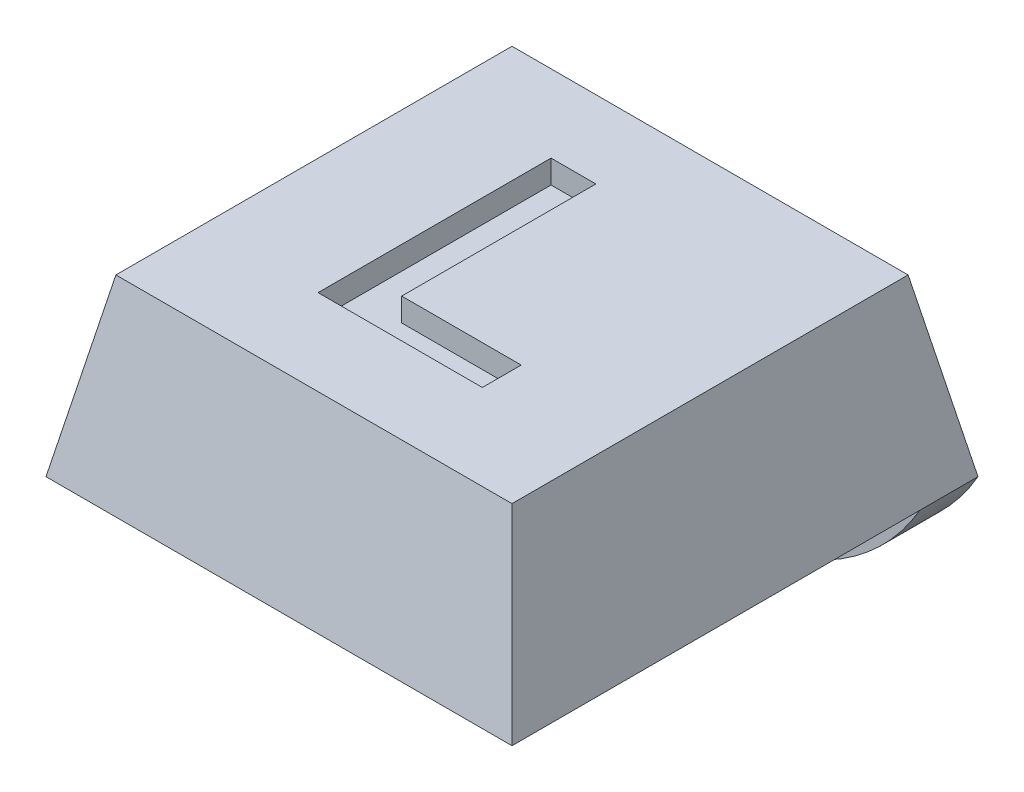
ISO-10303-21;
HEADER;
FILE_DESCRIPTION(('STEP AP214'),'2;1');
FILE_NAME('part.step','',(''),(''),'','','');
FILE_SCHEMA(('AUTOMOTIVE_DESIGN { 1 0 10303 214 1 1 1 1 }'));
ENDSEC;
DATA;
#1=APPLICATION_CONTEXT('core data for automotive mechanical design processes');
#2=APPLICATION_PROTOCOL_DEFINITION('international standard','automotive_design',2000,#1);
#3=PRODUCT_CONTEXT('',#1,'mechanical');
#4=PRODUCT('Part','Part','',(#3));
#5=PRODUCT_RELATED_PRODUCT_CATEGORY('part','',(#4));
#6=PRODUCT_DEFINITION_FORMATION('','',#4);
#7=PRODUCT_DEFINITION_CONTEXT('part definition',#1,'design');
#8=PRODUCT_DEFINITION('design','',#6,#7);
#9=PRODUCT_DEFINITION_SHAPE('','',#8);
#10=(LENGTH_UNIT() NAMED_UNIT(*) SI_UNIT(.MILLI.,.METRE.));
#11=(NAMED_UNIT(*) PLANE_ANGLE_UNIT() SI_UNIT($,.RADIAN.));
#12=(NAMED_UNIT(*) SI_UNIT($,.STERADIAN.) SOLID_ANGLE_UNIT());
#13=UNCERTAINTY_MEASURE_WITH_UNIT(LENGTH_MEASURE(1.E-05),#10,'distance_accuracy_value','');
#14=(GEOMETRIC_REPRESENTATION_CONTEXT(3) GLOBAL_UNCERTAINTY_ASSIGNED_CONTEXT((#13)) GLOBAL_UNIT_ASSIGNED_CONTEXT((#10,
#11,#12)) REPRESENTATION_CONTEXT('',''));
#15=CARTESIAN_POINT('',(0.,0.,0.));
#16=DIRECTION('',(0.,0.,1.));
#17=DIRECTION('',(1.,0.,0.));
#18=AXIS2_PLACEMENT_3D('',#15,#16,#17);
#19=CARTESIAN_POINT('',(0.,3.,0.));
#20=DIRECTION('',(0.,-1.,0.));
#21=DIRECTION('',(0.,0.,-1.));
#22=AXIS2_PLACEMENT_3D('',#19,#20,#21);
#23=PLANE('',#22);
#24=DIRECTION('',(-1.,0.,0.));
#25=VECTOR('',#24,1.);
#26=CARTESIAN_POINT('',(11.,3.,-0.6));
#27=LINE('',#26,#25);
#28=CARTESIAN_POINT('',(7.4,3.,-0.6));
#29=VERTEX_POINT('',#28);
#30=CARTESIAN_POINT('',(0.6,3.,-0.6));
#31=VERTEX_POINT('',#30);
#32=EDGE_CURVE('E194',#29,#31,#27,.T.);
#33=ORIENTED_EDGE('',*,*,#32,.F.);
#34=DIRECTION('',(0.,0.,1.));
#35=VECTOR('',#34,1.);
#36=CARTESIAN_POINT('',(7.4,3.,-8.));
#37=LINE('',#36,#35);
#38=CARTESIAN_POINT('',(7.4,3.,-7.4));
#39=VERTEX_POINT('',#38);
#40=EDGE_CURVE('E207',#39,#29,#37,.T.);
#41=ORIENTED_EDGE('',*,*,#40,.F.);
#42=DIRECTION('',(-1.,0.,0.));
#43=VECTOR('',#42,1.);
#44=CARTESIAN_POINT('',(11.,3.,-7.4));
#45=LINE('',#44,#43);
#46=CARTESIAN_POINT('',(0.599999999999999,3.,-7.4));
#47=VERTEX_POINT('',#46);
#48=EDGE_CURVE('E190',#39,#47,#45,.T.);
#49=ORIENTED_EDGE('',*,*,#48,.T.);
#50=DIRECTION('',(0.,0.,1.));
#51=VECTOR('',#50,1.);
#52=CARTESIAN_POINT('',(0.6,3.,-8.));
#53=LINE('',#52,#51);
#54=EDGE_CURVE('E210',#47,#31,#53,.T.);
#55=ORIENTED_EDGE('',*,*,#54,.T.);
#56=EDGE_LOOP('',(#33,#41,#49,#55));
#57=FACE_BOUND('',#56,.T.);
#58=DIRECTION('',(-1.,0.,0.));
#59=VECTOR('',#58,1.);
#60=CARTESIAN_POINT('',(5.41871403816439,3.,-2.07225420999487));
#61=LINE('',#60,#59);
#62=CARTESIAN_POINT('',(5.41871403816439,3.,-2.07225420999487));
#63=VERTEX_POINT('',#62);
#64=CARTESIAN_POINT('',(2.59820121765157,3.,-2.07225420999487));
#65=VERTEX_POINT('',#64);
#66=EDGE_CURVE('E59',#63,#65,#61,.T.);
#67=ORIENTED_EDGE('',*,*,#66,.T.);
#68=DIRECTION('',(0.,0.,-1.));
#69=VECTOR('',#68,1.);
#70=CARTESIAN_POINT('',(2.59820121765157,3.,-2.07225420999487));
#71=LINE('',#70,#69);
#72=CARTESIAN_POINT('',(2.59820121765157,3.,-6.07225420999487));
#73=VERTEX_POINT('',#72);
#74=EDGE_CURVE('E162',#65,#73,#71,.T.);
#75=ORIENTED_EDGE('',*,*,#74,.T.);
#76=DIRECTION('',(1.,0.,0.));
#77=VECTOR('',#76,1.);
#78=CARTESIAN_POINT('',(2.59820121765157,3.,-6.07225420999487));
#79=LINE('',#78,#77);
#80=CARTESIAN_POINT('',(3.36743198688234,3.,-6.07225420999487));
#81=VERTEX_POINT('',#80);
#82=EDGE_CURVE('E525',#73,#81,#79,.T.);
#83=ORIENTED_EDGE('',*,*,#82,.T.);
#84=DIRECTION('',(0.,0.,1.));
#85=VECTOR('',#84,1.);
#86=CARTESIAN_POINT('',(3.36743198688234,3.,-6.07225420999487));
#87=LINE('',#86,#85);
#88=CARTESIAN_POINT('',(3.36743198688234,3.,-2.73892087666153));
#89=VERTEX_POINT('',#88);
#90=EDGE_CURVE('E520',#81,#89,#87,.T.);
#91=ORIENTED_EDGE('',*,*,#90,.T.);
#92=DIRECTION('',(1.,0.,0.));
#93=VECTOR('',#92,1.);
#94=CARTESIAN_POINT('',(3.36743198688234,3.,-2.73892087666153));
#95=LINE('',#94,#93);
#96=CARTESIAN_POINT('',(5.41871403816439,3.,-2.73892087666153));
#97=VERTEX_POINT('',#96);
#98=EDGE_CURVE('E514',#89,#97,#95,.T.);
#99=ORIENTED_EDGE('',*,*,#98,.T.);
#100=DIRECTION('',(0.,0.,1.));
#101=VECTOR('',#100,1.);
#102=CARTESIAN_POINT('',(5.41871403816439,3.,-2.73892087666153));
#103=LINE('',#102,#101);
#104=EDGE_CURVE('E158',#97,#63,#103,.T.);
#105=ORIENTED_EDGE('',*,*,#104,.T.);
#106=EDGE_LOOP('',(#67,#75,#83,#91,#99,#105));
#107=FACE_BOUND('',#106,.T.);
#108=ADVANCED_FACE('F43',(#57,#107),#23,.F.);
#109=CARTESIAN_POINT('',(8.,0.,-8.));
#110=DIRECTION('',(-0.98058067569092,-0.196116135138184,0.));
#111=DIRECTION('',(0.196116135138184,-0.98058067569092,0.));
#112=AXIS2_PLACEMENT_3D('',#109,#110,#111);
#113=PLANE('',#112);
#114=DIRECTION('',(-0.192450089729875,0.962250448649376,-0.192450089729875));
#115=VECTOR('',#114,1.);
#116=CARTESIAN_POINT('',(7.7037037037037,1.48148148148148,-0.296296296296296));
#117=LINE('',#116,#115);
#118=CARTESIAN_POINT('',(8.,0.,0.));
#119=VERTEX_POINT('',#118);
#120=EDGE_CURVE('E204',#119,#29,#117,.T.);
#121=ORIENTED_EDGE('',*,*,#120,.F.);
#122=DIRECTION('',(0.,0.,-1.));
#123=VECTOR('',#122,1.);
#124=CARTESIAN_POINT('',(8.,0.,0.));
#125=LINE('',#124,#123);
#126=CARTESIAN_POINT('',(8.,0.,-7.));
#127=VERTEX_POINT('',#126);
#128=EDGE_CURVE('E223',#119,#127,#125,.T.);
#129=ORIENTED_EDGE('',*,*,#128,.T.);
#130=DIRECTION('',(0.,0.,1.));
#131=VECTOR('',#130,1.);
#132=CARTESIAN_POINT('',(8.,0.,-8.));
#133=LINE('',#132,#131);
#134=CARTESIAN_POINT('',(8.,0.,-8.));
#135=VERTEX_POINT('',#134);
#136=EDGE_CURVE('E164',#135,#127,#133,.T.);
#137=ORIENTED_EDGE('',*,*,#136,.F.);
#138=DIRECTION('',(0.192450089729875,-0.962250448649376,-0.192450089729875));
#139=VECTOR('',#138,1.);
#140=CARTESIAN_POINT('',(8.,0.,-8.));
#141=LINE('',#140,#139);
#142=EDGE_CURVE('E197',#39,#135,#141,.T.);
#143=ORIENTED_EDGE('',*,*,#142,.F.);
#144=ORIENTED_EDGE('',*,*,#40,.T.);
#145=EDGE_LOOP('',(#121,#129,#137,#143,#144));
#146=FACE_BOUND('',#145,.T.);
#147=ADVANCED_FACE('F291',(#146),#113,.F.);
#148=CARTESIAN_POINT('',(0.,0.,-8.));
#149=DIRECTION('',(0.98058067569092,-0.196116135138184,0.));
#150=DIRECTION('',(0.196116135138184,0.98058067569092,0.));
#151=AXIS2_PLACEMENT_3D('',#148,#149,#150);
#152=PLANE('',#151);
#153=DIRECTION('',(-0.192450089729875,-0.962250448649376,0.192450089729875));
#154=VECTOR('',#153,1.);
#155=CARTESIAN_POINT('',(0.296296296296296,1.48148148148148,-0.296296296296296));
#156=LINE('',#155,#154);
#157=CARTESIAN_POINT('',(0.,0.,0.));
#158=VERTEX_POINT('',#157);
#159=EDGE_CURVE('E251',#31,#158,#156,.T.);
#160=ORIENTED_EDGE('',*,*,#159,.F.);
#161=ORIENTED_EDGE('',*,*,#54,.F.);
#162=DIRECTION('',(0.192450089729875,0.962250448649376,0.192450089729875));
#163=VECTOR('',#162,1.);
#164=CARTESIAN_POINT('',(0.,0.,-8.));
#165=LINE('',#164,#163);
#166=CARTESIAN_POINT('',(0.,0.,-8.));
#167=VERTEX_POINT('',#166);
#168=EDGE_CURVE('E222',#167,#47,#165,.T.);
#169=ORIENTED_EDGE('',*,*,#168,.F.);
#170=DIRECTION('',(0.,0.,1.));
#171=VECTOR('',#170,1.);
#172=CARTESIAN_POINT('',(0.,0.,0.));
#173=LINE('',#172,#171);
#174=CARTESIAN_POINT('',(0.,0.,-7.));
#175=VERTEX_POINT('',#174);
#176=EDGE_CURVE('E227',#167,#175,#173,.T.);
#177=ORIENTED_EDGE('',*,*,#176,.T.);
#178=EDGE_CURVE('E214',#175,#158,#173,.T.);
#179=ORIENTED_EDGE('',*,*,#178,.T.);
#180=EDGE_LOOP('',(#160,#161,#169,#177,#179));
#181=FACE_BOUND('',#180,.T.);
#182=ADVANCED_FACE('F275',(#181),#152,.F.);
#183=CARTESIAN_POINT('',(0.,0.,0.));
#184=DIRECTION('',(0.,-1.,0.));
#185=DIRECTION('',(0.,0.,-1.));
#186=AXIS2_PLACEMENT_3D('',#183,#184,#185);
#187=PLANE('',#186);
#188=DIRECTION('',(-1.,0.,0.));
#189=VECTOR('',#188,1.);
#190=CARTESIAN_POINT('',(0.,0.,-7.));
#191=LINE('',#190,#189);
#192=EDGE_CURVE('E170',#127,#175,#191,.T.);
#193=ORIENTED_EDGE('',*,*,#192,.F.);
#194=ORIENTED_EDGE('',*,*,#128,.F.);
#195=DIRECTION('',(1.,0.,0.));
#196=VECTOR('',#195,1.);
#197=CARTESIAN_POINT('',(0.,0.,0.));
#198=LINE('',#197,#196);
#199=EDGE_CURVE('E224',#158,#119,#198,.T.);
#200=ORIENTED_EDGE('',*,*,#199,.F.);
#201=ORIENTED_EDGE('',*,*,#178,.F.);
#202=EDGE_LOOP('',(#193,#194,#200,#201));
#203=FACE_BOUND('',#202,.T.);
#204=CARTESIAN_POINT('',(4.,0.,-3.75));
#205=DIRECTION('',(0.,-1.,0.));
#206=DIRECTION('',(0.,0.,-1.));
#207=AXIS2_PLACEMENT_3D('',#204,#205,#206);
#208=CIRCLE('',#207,1.75);
#209=CARTESIAN_POINT('',(4.,0.,-5.5));
#210=VERTEX_POINT('',#209);
#211=EDGE_CURVE('E182',#210,#210,#208,.T.);
#212=ORIENTED_EDGE('',*,*,#211,.F.);
#213=EDGE_LOOP('',(#212));
#214=FACE_BOUND('',#213,.T.);
#215=ADVANCED_FACE('F286',(#203,#214),#187,.T.);
#216=CARTESIAN_POINT('',(11.,3.,-7.4));
#217=DIRECTION('',(0.,0.196116135138184,-0.98058067569092));
#218=DIRECTION('',(0.,0.98058067569092,0.196116135138184));
#219=AXIS2_PLACEMENT_3D('',#216,#217,#218);
#220=PLANE('',#219);
#221=ORIENTED_EDGE('',*,*,#142,.T.);
#222=DIRECTION('',(-1.,0.,0.));
#223=VECTOR('',#222,1.);
#224=CARTESIAN_POINT('',(0.,0.,-8.));
#225=LINE('',#224,#223);
#226=EDGE_CURVE('E218',#135,#167,#225,.T.);
#227=ORIENTED_EDGE('',*,*,#226,.T.);
#228=ORIENTED_EDGE('',*,*,#168,.T.);
#229=ORIENTED_EDGE('',*,*,#48,.F.);
#230=EDGE_LOOP('',(#221,#227,#228,#229));
#231=FACE_BOUND('',#230,.T.);
#232=ADVANCED_FACE('F270',(#231),#220,.T.);
#233=CARTESIAN_POINT('',(11.,0.,0.));
#234=DIRECTION('',(0.,0.196116135138184,0.98058067569092));
#235=DIRECTION('',(0.,-0.98058067569092,0.196116135138184));
#236=AXIS2_PLACEMENT_3D('',#233,#234,#235);
#237=PLANE('',#236);
#238=ORIENTED_EDGE('',*,*,#120,.T.);
#239=ORIENTED_EDGE('',*,*,#32,.T.);
#240=ORIENTED_EDGE('',*,*,#159,.T.);
#241=ORIENTED_EDGE('',*,*,#199,.T.);
#242=EDGE_LOOP('',(#238,#239,#240,#241));
#243=FACE_BOUND('',#242,.T.);
#244=ADVANCED_FACE('F315',(#243),#237,.T.);
#245=CARTESIAN_POINT('',(4.,0.4,-3.75));
#246=DIRECTION('',(0.,-1.,0.));
#247=DIRECTION('',(0.,0.,-1.));
#248=AXIS2_PLACEMENT_3D('',#245,#246,#247);
#249=CYLINDRICAL_SURFACE('',#248,1.75);
#250=CARTESIAN_POINT('',(4.,0.4,-3.75));
#251=DIRECTION('',(0.,-1.,0.));
#252=DIRECTION('',(0.,0.,-1.));
#253=AXIS2_PLACEMENT_3D('',#250,#251,#252);
#254=CIRCLE('',#253,1.75);
#255=CARTESIAN_POINT('',(4.,0.4,-5.5));
#256=VERTEX_POINT('',#255);
#257=EDGE_CURVE('E186',#256,#256,#254,.T.);
#258=ORIENTED_EDGE('',*,*,#257,.F.);
#259=EDGE_LOOP('',(#258));
#260=FACE_BOUND('',#259,.T.);
#261=ORIENTED_EDGE('',*,*,#211,.T.);
#262=EDGE_LOOP('',(#261));
#263=FACE_BOUND('',#262,.T.);
#264=ADVANCED_FACE('F322',(#260,#263),#249,.F.);
#265=CARTESIAN_POINT('',(4.,0.4,-3.75));
#266=DIRECTION('',(0.,-1.,0.));
#267=DIRECTION('',(0.,0.,-1.));
#268=AXIS2_PLACEMENT_3D('',#265,#266,#267);
#269=PLANE('',#268);
#270=ORIENTED_EDGE('',*,*,#257,.T.);
#271=EDGE_LOOP('',(#270));
#272=FACE_BOUND('',#271,.T.);
#273=ADVANCED_FACE('F326',(#272),#269,.T.);
#274=CARTESIAN_POINT('',(0.,-2.,-8.));
#275=DIRECTION('',(0.,0.,1.));
#276=DIRECTION('',(1.,0.,0.));
#277=AXIS2_PLACEMENT_3D('',#274,#275,#276);
#278=PLANE('',#277);
#279=ORIENTED_EDGE('',*,*,#226,.F.);
#280=CARTESIAN_POINT('',(4.53589838486225,2.,-8.));
#281=DIRECTION('',(0.,0.,1.));
#282=DIRECTION('',(1.,0.,0.));
#283=AXIS2_PLACEMENT_3D('',#280,#281,#282);
#284=CIRCLE('',#283,4.);
#285=CARTESIAN_POINT('',(4.53589838486225,-2.,-8.));
#286=VERTEX_POINT('',#285);
#287=EDGE_CURVE('E11',#135,#286,#284,.F.);
#288=ORIENTED_EDGE('',*,*,#287,.T.);
#289=DIRECTION('',(1.,0.,0.));
#290=VECTOR('',#289,1.);
#291=CARTESIAN_POINT('',(0.,-2.,-8.));
#292=LINE('',#291,#290);
#293=CARTESIAN_POINT('',(3.46410161513775,-2.,-8.));
#294=VERTEX_POINT('',#293);
#295=EDGE_CURVE('E176',#294,#286,#292,.T.);
#296=ORIENTED_EDGE('',*,*,#295,.F.);
#297=CARTESIAN_POINT('',(3.46410161513775,2.,-8.));
#298=DIRECTION('',(0.,0.,1.));
#299=DIRECTION('',(1.,0.,0.));
#300=AXIS2_PLACEMENT_3D('',#297,#298,#299);
#301=CIRCLE('',#300,4.);
#302=EDGE_CURVE('E52',#294,#167,#301,.F.);
#303=ORIENTED_EDGE('',*,*,#302,.T.);
#304=EDGE_LOOP('',(#279,#288,#296,#303));
#305=FACE_BOUND('',#304,.T.);
#306=ADVANCED_FACE('F263',(#305),#278,.F.);
#307=CARTESIAN_POINT('',(0.,-2.,-7.));
#308=DIRECTION('',(0.,0.,-1.));
#309=DIRECTION('',(-1.,0.,0.));
#310=AXIS2_PLACEMENT_3D('',#307,#308,#309);
#311=PLANE('',#310);
#312=DIRECTION('',(-1.,0.,0.));
#313=VECTOR('',#312,1.);
#314=CARTESIAN_POINT('',(0.,-2.,-7.));
#315=LINE('',#314,#313);
#316=CARTESIAN_POINT('',(4.53589838486225,-2.,-7.));
#317=VERTEX_POINT('',#316);
#318=CARTESIAN_POINT('',(3.46410161513775,-2.,-7.));
#319=VERTEX_POINT('',#318);
#320=EDGE_CURVE('E180',#317,#319,#315,.T.);
#321=ORIENTED_EDGE('',*,*,#320,.F.);
#322=CARTESIAN_POINT('',(4.53589838486225,2.,-7.));
#323=DIRECTION('',(0.,0.,-1.));
#324=DIRECTION('',(-1.,0.,0.));
#325=AXIS2_PLACEMENT_3D('',#322,#323,#324);
#326=CIRCLE('',#325,4.);
#327=EDGE_CURVE('E257',#317,#127,#326,.F.);
#328=ORIENTED_EDGE('',*,*,#327,.T.);
#329=ORIENTED_EDGE('',*,*,#192,.T.);
#330=CARTESIAN_POINT('',(3.46410161513775,2.,-7.));
#331=DIRECTION('',(0.,0.,-1.));
#332=DIRECTION('',(-1.,0.,0.));
#333=AXIS2_PLACEMENT_3D('',#330,#331,#332);
#334=CIRCLE('',#333,4.);
#335=EDGE_CURVE('E67',#175,#319,#334,.F.);
#336=ORIENTED_EDGE('',*,*,#335,.T.);
#337=EDGE_LOOP('',(#321,#328,#329,#336));
#338=FACE_BOUND('',#337,.T.);
#339=ADVANCED_FACE('F281',(#338),#311,.F.);
#340=CARTESIAN_POINT('',(0.,-2.,0.));
#341=DIRECTION('',(0.,1.,0.));
#342=DIRECTION('',(0.,0.,1.));
#343=AXIS2_PLACEMENT_3D('',#340,#341,#342);
#344=PLANE('',#343);
#345=ORIENTED_EDGE('',*,*,#295,.T.);
#346=DIRECTION('',(0.,0.,1.));
#347=VECTOR('',#346,1.);
#348=CARTESIAN_POINT('',(4.53589838486225,-2.,0.));
#349=LINE('',#348,#347);
#350=EDGE_CURVE('E250',#286,#317,#349,.T.);
#351=ORIENTED_EDGE('',*,*,#350,.T.);
#352=ORIENTED_EDGE('',*,*,#320,.T.);
#353=DIRECTION('',(0.,0.,-1.));
#354=VECTOR('',#353,1.);
#355=CARTESIAN_POINT('',(3.46410161513775,-2.,0.));
#356=LINE('',#355,#354);
#357=EDGE_CURVE('E246',#319,#294,#356,.T.);
#358=ORIENTED_EDGE('',*,*,#357,.T.);
#359=EDGE_LOOP('',(#345,#351,#352,#358));
#360=FACE_BOUND('',#359,.T.);
#361=ADVANCED_FACE('F279',(#360),#344,.F.);
#362=CARTESIAN_POINT('',(4.53589838486225,2.,-8.));
#363=DIRECTION('',(0.,0.,1.));
#364=DIRECTION('',(1.,0.,0.));
#365=AXIS2_PLACEMENT_3D('',#362,#363,#364);
#366=CYLINDRICAL_SURFACE('',#365,4.);
#367=ORIENTED_EDGE('',*,*,#287,.F.);
#368=ORIENTED_EDGE('',*,*,#136,.T.);
#369=ORIENTED_EDGE('',*,*,#327,.F.);
#370=ORIENTED_EDGE('',*,*,#350,.F.);
#371=EDGE_LOOP('',(#367,#368,#369,#370));
#372=FACE_BOUND('',#371,.T.);
#373=ADVANCED_FACE('F292',(#372),#366,.T.);
#374=CARTESIAN_POINT('',(3.46410161513775,2.,-8.));
#375=DIRECTION('',(0.,0.,-1.));
#376=DIRECTION('',(-1.,0.,0.));
#377=AXIS2_PLACEMENT_3D('',#374,#375,#376);
#378=CYLINDRICAL_SURFACE('',#377,4.);
#379=ORIENTED_EDGE('',*,*,#335,.F.);
#380=ORIENTED_EDGE('',*,*,#176,.F.);
#381=ORIENTED_EDGE('',*,*,#302,.F.);
#382=ORIENTED_EDGE('',*,*,#357,.F.);
#383=EDGE_LOOP('',(#379,#380,#381,#382));
#384=FACE_BOUND('',#383,.T.);
#385=ADVANCED_FACE('F45',(#384),#378,.T.);
#386=CARTESIAN_POINT('',(5.41871403816439,2.6,-2.07225420999487));
#387=DIRECTION('',(0.,0.,-1.));
#388=DIRECTION('',(-1.,0.,0.));
#389=AXIS2_PLACEMENT_3D('',#386,#387,#388);
#390=PLANE('',#389);
#391=ORIENTED_EDGE('',*,*,#66,.F.);
#392=DIRECTION('',(0.,1.,0.));
#393=VECTOR('',#392,1.);
#394=CARTESIAN_POINT('',(5.41871403816439,2.6,-2.07225420999487));
#395=LINE('',#394,#393);
#396=CARTESIAN_POINT('',(5.41871403816439,2.6,-2.07225420999487));
#397=VERTEX_POINT('',#396);
#398=EDGE_CURVE('E156',#397,#63,#395,.T.);
#399=ORIENTED_EDGE('',*,*,#398,.F.);
#400=DIRECTION('',(-1.,0.,0.));
#401=VECTOR('',#400,1.);
#402=CARTESIAN_POINT('',(5.41871403816439,2.6,-2.07225420999487));
#403=LINE('',#402,#401);
#404=CARTESIAN_POINT('',(2.59820121765157,2.6,-2.07225420999487));
#405=VERTEX_POINT('',#404);
#406=EDGE_CURVE('E146',#397,#405,#403,.T.);
#407=ORIENTED_EDGE('',*,*,#406,.T.);
#408=DIRECTION('',(0.,1.,0.));
#409=VECTOR('',#408,1.);
#410=CARTESIAN_POINT('',(2.59820121765157,2.6,-2.07225420999487));
#411=LINE('',#410,#409);
#412=EDGE_CURVE('E155',#405,#65,#411,.T.);
#413=ORIENTED_EDGE('',*,*,#412,.T.);
#414=EDGE_LOOP('',(#391,#399,#407,#413));
#415=FACE_BOUND('',#414,.T.);
#416=ADVANCED_FACE('F154',(#415),#390,.T.);
#417=CARTESIAN_POINT('',(2.59820121765157,2.6,-2.07225420999487));
#418=DIRECTION('',(1.,0.,0.));
#419=DIRECTION('',(0.,0.,-1.));
#420=AXIS2_PLACEMENT_3D('',#417,#418,#419);
#421=PLANE('',#420);
#422=ORIENTED_EDGE('',*,*,#74,.F.);
#423=ORIENTED_EDGE('',*,*,#412,.F.);
#424=DIRECTION('',(0.,0.,-1.));
#425=VECTOR('',#424,1.);
#426=CARTESIAN_POINT('',(2.59820121765157,2.6,-2.07225420999487));
#427=LINE('',#426,#425);
#428=CARTESIAN_POINT('',(2.59820121765157,2.6,-6.07225420999487));
#429=VERTEX_POINT('',#428);
#430=EDGE_CURVE('E142',#405,#429,#427,.T.);
#431=ORIENTED_EDGE('',*,*,#430,.T.);
#432=DIRECTION('',(0.,1.,0.));
#433=VECTOR('',#432,1.);
#434=CARTESIAN_POINT('',(2.59820121765157,2.6,-6.07225420999487));
#435=LINE('',#434,#433);
#436=EDGE_CURVE('E165',#429,#73,#435,.T.);
#437=ORIENTED_EDGE('',*,*,#436,.T.);
#438=EDGE_LOOP('',(#422,#423,#431,#437));
#439=FACE_BOUND('',#438,.T.);
#440=ADVANCED_FACE('F160',(#439),#421,.T.);
#441=CARTESIAN_POINT('',(2.59820121765157,2.6,-6.07225420999487));
#442=DIRECTION('',(0.,0.,1.));
#443=DIRECTION('',(1.,0.,0.));
#444=AXIS2_PLACEMENT_3D('',#441,#442,#443);
#445=PLANE('',#444);
#446=ORIENTED_EDGE('',*,*,#82,.F.);
#447=ORIENTED_EDGE('',*,*,#436,.F.);
#448=DIRECTION('',(1.,0.,0.));
#449=VECTOR('',#448,1.);
#450=CARTESIAN_POINT('',(2.59820121765157,2.6,-6.07225420999487));
#451=LINE('',#450,#449);
#452=CARTESIAN_POINT('',(3.36743198688234,2.6,-6.07225420999487));
#453=VERTEX_POINT('',#452);
#454=EDGE_CURVE('E148',#429,#453,#451,.T.);
#455=ORIENTED_EDGE('',*,*,#454,.T.);
#456=DIRECTION('',(0.,1.,0.));
#457=VECTOR('',#456,1.);
#458=CARTESIAN_POINT('',(3.36743198688234,2.6,-6.07225420999487));
#459=LINE('',#458,#457);
#460=EDGE_CURVE('E172',#453,#81,#459,.T.);
#461=ORIENTED_EDGE('',*,*,#460,.T.);
#462=EDGE_LOOP('',(#446,#447,#455,#461));
#463=FACE_BOUND('',#462,.T.);
#464=ADVANCED_FACE('F339',(#463),#445,.T.);
#465=CARTESIAN_POINT('',(3.36743198688234,2.6,-6.07225420999487));
#466=DIRECTION('',(-1.,0.,0.));
#467=DIRECTION('',(0.,0.,1.));
#468=AXIS2_PLACEMENT_3D('',#465,#466,#467);
#469=PLANE('',#468);
#470=ORIENTED_EDGE('',*,*,#90,.F.);
#471=ORIENTED_EDGE('',*,*,#460,.F.);
#472=DIRECTION('',(0.,0.,1.));
#473=VECTOR('',#472,1.);
#474=CARTESIAN_POINT('',(3.36743198688234,2.6,-6.07225420999487));
#475=LINE('',#474,#473);
#476=CARTESIAN_POINT('',(3.36743198688234,2.6,-2.73892087666153));
#477=VERTEX_POINT('',#476);
#478=EDGE_CURVE('E550',#453,#477,#475,.T.);
#479=ORIENTED_EDGE('',*,*,#478,.T.);
#480=DIRECTION('',(0.,1.,0.));
#481=VECTOR('',#480,1.);
#482=CARTESIAN_POINT('',(3.36743198688234,2.6,-2.73892087666153));
#483=LINE('',#482,#481);
#484=EDGE_CURVE('E534',#477,#89,#483,.T.);
#485=ORIENTED_EDGE('',*,*,#484,.T.);
#486=EDGE_LOOP('',(#470,#471,#479,#485));
#487=FACE_BOUND('',#486,.T.);
#488=ADVANCED_FACE('F342',(#487),#469,.T.);
#489=CARTESIAN_POINT('',(3.36743198688234,2.6,-2.73892087666153));
#490=DIRECTION('',(0.,0.,1.));
#491=DIRECTION('',(1.,0.,0.));
#492=AXIS2_PLACEMENT_3D('',#489,#490,#491);
#493=PLANE('',#492);
#494=ORIENTED_EDGE('',*,*,#98,.F.);
#495=ORIENTED_EDGE('',*,*,#484,.F.);
#496=DIRECTION('',(1.,0.,0.));
#497=VECTOR('',#496,1.);
#498=CARTESIAN_POINT('',(3.36743198688234,2.6,-2.73892087666153));
#499=LINE('',#498,#497);
#500=CARTESIAN_POINT('',(5.41871403816439,2.6,-2.73892087666153));
#501=VERTEX_POINT('',#500);
#502=EDGE_CURVE('E547',#477,#501,#499,.T.);
#503=ORIENTED_EDGE('',*,*,#502,.T.);
#504=DIRECTION('',(0.,1.,0.));
#505=VECTOR('',#504,1.);
#506=CARTESIAN_POINT('',(5.41871403816439,2.6,-2.73892087666153));
#507=LINE('',#506,#505);
#508=EDGE_CURVE('E512',#501,#97,#507,.T.);
#509=ORIENTED_EDGE('',*,*,#508,.T.);
#510=EDGE_LOOP('',(#494,#495,#503,#509));
#511=FACE_BOUND('',#510,.T.);
#512=ADVANCED_FACE('F346',(#511),#493,.T.);
#513=CARTESIAN_POINT('',(5.41871403816439,2.6,-2.73892087666153));
#514=DIRECTION('',(-1.,0.,0.));
#515=DIRECTION('',(0.,0.,1.));
#516=AXIS2_PLACEMENT_3D('',#513,#514,#515);
#517=PLANE('',#516);
#518=ORIENTED_EDGE('',*,*,#104,.F.);
#519=ORIENTED_EDGE('',*,*,#508,.F.);
#520=DIRECTION('',(0.,0.,1.));
#521=VECTOR('',#520,1.);
#522=CARTESIAN_POINT('',(5.41871403816439,2.6,-2.73892087666153));
#523=LINE('',#522,#521);
#524=EDGE_CURVE('E531',#501,#397,#523,.T.);
#525=ORIENTED_EDGE('',*,*,#524,.T.);
#526=ORIENTED_EDGE('',*,*,#398,.T.);
#527=EDGE_LOOP('',(#518,#519,#525,#526));
#528=FACE_BOUND('',#527,.T.);
#529=ADVANCED_FACE('F350',(#528),#517,.T.);
#530=CARTESIAN_POINT('',(0.,2.6,0.));
#531=DIRECTION('',(0.,-1.,0.));
#532=DIRECTION('',(0.,0.,-1.));
#533=AXIS2_PLACEMENT_3D('',#530,#531,#532);
#534=PLANE('',#533);
#535=ORIENTED_EDGE('',*,*,#406,.F.);
#536=ORIENTED_EDGE('',*,*,#524,.F.);
#537=ORIENTED_EDGE('',*,*,#502,.F.);
#538=ORIENTED_EDGE('',*,*,#478,.F.);
#539=ORIENTED_EDGE('',*,*,#454,.F.);
#540=ORIENTED_EDGE('',*,*,#430,.F.);
#541=EDGE_LOOP('',(#535,#536,#537,#538,#539,#540));
#542=FACE_BOUND('',#541,.T.);
#543=ADVANCED_FACE('F144',(#542),#534,.F.);
#544=CLOSED_SHELL('',(#108,#147,#182,#215,#232,#244,#264,#273,#306,#339,#361,#373,#385,#416,
#440,#464,#488,#512,#529,#543));
#545=MANIFOLD_SOLID_BREP('B2',#544);
#546=ADVANCED_BREP_SHAPE_REPRESENTATION('',(#18,#545),#14);
#547=SHAPE_DEFINITION_REPRESENTATION(#9,#546);
ENDSEC;
END-ISO-10303-21;
